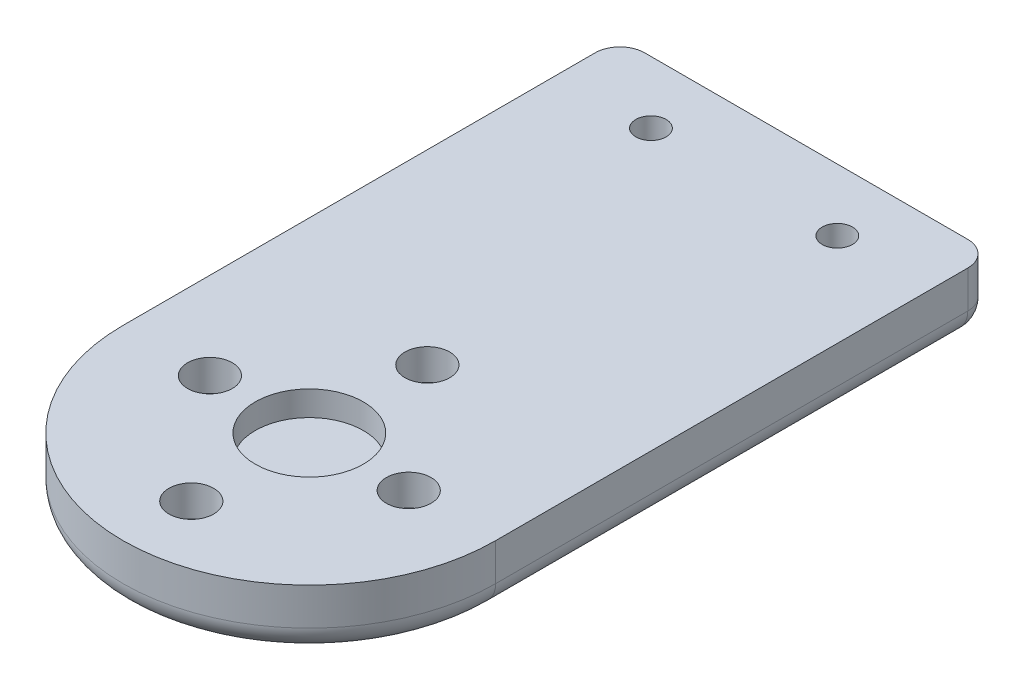
ISO-10303-21;
HEADER;
FILE_DESCRIPTION(('STEP AP214'),'2;1');
FILE_NAME('part.step','',(''),(''),'','','');
FILE_SCHEMA(('AUTOMOTIVE_DESIGN { 1 0 10303 214 1 1 1 1 }'));
ENDSEC;
DATA;
#1=APPLICATION_CONTEXT('core data for automotive mechanical design processes');
#2=APPLICATION_PROTOCOL_DEFINITION('international standard','automotive_design',2000,#1);
#3=PRODUCT_CONTEXT('',#1,'mechanical');
#4=PRODUCT('Part','Part','',(#3));
#5=PRODUCT_RELATED_PRODUCT_CATEGORY('part','',(#4));
#6=PRODUCT_DEFINITION_FORMATION('','',#4);
#7=PRODUCT_DEFINITION_CONTEXT('part definition',#1,'design');
#8=PRODUCT_DEFINITION('design','',#6,#7);
#9=PRODUCT_DEFINITION_SHAPE('','',#8);
#10=(LENGTH_UNIT() NAMED_UNIT(*) SI_UNIT(.MILLI.,.METRE.));
#11=(NAMED_UNIT(*) PLANE_ANGLE_UNIT() SI_UNIT($,.RADIAN.));
#12=(NAMED_UNIT(*) SI_UNIT($,.STERADIAN.) SOLID_ANGLE_UNIT());
#13=UNCERTAINTY_MEASURE_WITH_UNIT(LENGTH_MEASURE(1.E-05),#10,'distance_accuracy_value','');
#14=(GEOMETRIC_REPRESENTATION_CONTEXT(3) GLOBAL_UNCERTAINTY_ASSIGNED_CONTEXT((#13)) GLOBAL_UNIT_ASSIGNED_CONTEXT((#10,
#11,#12)) REPRESENTATION_CONTEXT('',''));
#15=CARTESIAN_POINT('',(0.,0.,0.));
#16=DIRECTION('',(0.,0.,1.));
#17=DIRECTION('',(1.,0.,0.));
#18=AXIS2_PLACEMENT_3D('',#15,#16,#17);
#19=CARTESIAN_POINT('',(0.,5.,0.));
#20=DIRECTION('',(0.,-1.,0.));
#21=DIRECTION('',(0.,0.,-1.));
#22=AXIS2_PLACEMENT_3D('',#19,#20,#21);
#23=CYLINDRICAL_SURFACE('',#22,15.);
#24=DIRECTION('',(0.,-1.,0.));
#25=VECTOR('',#24,1.);
#26=CARTESIAN_POINT('',(-15.,5.,0.));
#27=LINE('',#26,#25);
#28=CARTESIAN_POINT('',(-15.,5.,0.));
#29=VERTEX_POINT('',#28);
#30=CARTESIAN_POINT('',(-15.,2.,0.));
#31=VERTEX_POINT('',#30);
#32=EDGE_CURVE('E122',#29,#31,#27,.T.);
#33=ORIENTED_EDGE('',*,*,#32,.T.);
#34=CARTESIAN_POINT('',(0.,2.,0.));
#35=DIRECTION('',(0.,1.,0.));
#36=DIRECTION('',(0.,0.,1.));
#37=AXIS2_PLACEMENT_3D('',#34,#35,#36);
#38=CIRCLE('',#37,15.);
#39=CARTESIAN_POINT('',(15.,2.,0.));
#40=VERTEX_POINT('',#39);
#41=EDGE_CURVE('E121',#31,#40,#38,.T.);
#42=ORIENTED_EDGE('',*,*,#41,.T.);
#43=DIRECTION('',(0.,-1.,0.));
#44=VECTOR('',#43,1.);
#45=CARTESIAN_POINT('',(15.,5.,0.));
#46=LINE('',#45,#44);
#47=CARTESIAN_POINT('',(15.,5.,0.));
#48=VERTEX_POINT('',#47);
#49=EDGE_CURVE('E104',#48,#40,#46,.T.);
#50=ORIENTED_EDGE('',*,*,#49,.F.);
#51=CARTESIAN_POINT('',(0.,5.,0.));
#52=DIRECTION('',(0.,1.,0.));
#53=DIRECTION('',(0.,0.,1.));
#54=AXIS2_PLACEMENT_3D('',#51,#52,#53);
#55=CIRCLE('',#54,15.);
#56=EDGE_CURVE('E110',#29,#48,#55,.T.);
#57=ORIENTED_EDGE('',*,*,#56,.F.);
#58=EDGE_LOOP('',(#33,#42,#50,#57));
#59=FACE_BOUND('',#58,.T.);
#60=ADVANCED_FACE('F33',(#59),#23,.T.);
#61=CARTESIAN_POINT('',(15.,5.,-40.));
#62=DIRECTION('',(-1.,0.,0.));
#63=DIRECTION('',(0.,0.,1.));
#64=AXIS2_PLACEMENT_3D('',#61,#62,#63);
#65=PLANE('',#64);
#66=ORIENTED_EDGE('',*,*,#49,.T.);
#67=DIRECTION('',(0.,0.,-1.));
#68=VECTOR('',#67,1.);
#69=CARTESIAN_POINT('',(15.,2.,-40.));
#70=LINE('',#69,#68);
#71=CARTESIAN_POINT('',(15.,2.,-38.));
#72=VERTEX_POINT('',#71);
#73=EDGE_CURVE('E124',#40,#72,#70,.T.);
#74=ORIENTED_EDGE('',*,*,#73,.T.);
#75=DIRECTION('',(0.,-1.,0.));
#76=VECTOR('',#75,1.);
#77=CARTESIAN_POINT('',(15.,5.,-38.));
#78=LINE('',#77,#76);
#79=CARTESIAN_POINT('',(15.,5.,-38.));
#80=VERTEX_POINT('',#79);
#81=EDGE_CURVE('E107',#72,#80,#78,.F.);
#82=ORIENTED_EDGE('',*,*,#81,.T.);
#83=DIRECTION('',(0.,0.,-1.));
#84=VECTOR('',#83,1.);
#85=CARTESIAN_POINT('',(15.,5.,-40.));
#86=LINE('',#85,#84);
#87=EDGE_CURVE('E99',#48,#80,#86,.T.);
#88=ORIENTED_EDGE('',*,*,#87,.F.);
#89=EDGE_LOOP('',(#66,#74,#82,#88));
#90=FACE_BOUND('',#89,.T.);
#91=ADVANCED_FACE('F101',(#90),#65,.F.);
#92=CARTESIAN_POINT('',(-15.,5.,-40.));
#93=DIRECTION('',(0.,0.,1.));
#94=DIRECTION('',(1.,0.,0.));
#95=AXIS2_PLACEMENT_3D('',#92,#93,#94);
#96=PLANE('',#95);
#97=DIRECTION('',(-1.,0.,0.));
#98=VECTOR('',#97,1.);
#99=CARTESIAN_POINT('',(-15.,5.,-40.));
#100=LINE('',#99,#98);
#101=CARTESIAN_POINT('',(13.,5.,-40.));
#102=VERTEX_POINT('',#101);
#103=CARTESIAN_POINT('',(-13.,5.,-40.));
#104=VERTEX_POINT('',#103);
#105=EDGE_CURVE('E109',#102,#104,#100,.T.);
#106=ORIENTED_EDGE('',*,*,#105,.F.);
#107=DIRECTION('',(0.,-1.,0.));
#108=VECTOR('',#107,1.);
#109=CARTESIAN_POINT('',(13.,5.,-40.));
#110=LINE('',#109,#108);
#111=CARTESIAN_POINT('',(13.,2.,-40.));
#112=VERTEX_POINT('',#111);
#113=EDGE_CURVE('E144',#102,#112,#110,.T.);
#114=ORIENTED_EDGE('',*,*,#113,.T.);
#115=DIRECTION('',(-1.,0.,0.));
#116=VECTOR('',#115,1.);
#117=CARTESIAN_POINT('',(-15.,2.,-40.));
#118=LINE('',#117,#116);
#119=CARTESIAN_POINT('',(-13.,2.,-40.));
#120=VERTEX_POINT('',#119);
#121=EDGE_CURVE('E142',#112,#120,#118,.T.);
#122=ORIENTED_EDGE('',*,*,#121,.T.);
#123=DIRECTION('',(0.,-1.,0.));
#124=VECTOR('',#123,1.);
#125=CARTESIAN_POINT('',(-13.,5.,-40.));
#126=LINE('',#125,#124);
#127=EDGE_CURVE('E140',#120,#104,#126,.F.);
#128=ORIENTED_EDGE('',*,*,#127,.T.);
#129=EDGE_LOOP('',(#106,#114,#122,#128));
#130=FACE_BOUND('',#129,.T.);
#131=ADVANCED_FACE('F215',(#130),#96,.F.);
#132=CARTESIAN_POINT('',(-15.,5.,0.));
#133=DIRECTION('',(1.,0.,0.));
#134=DIRECTION('',(0.,0.,-1.));
#135=AXIS2_PLACEMENT_3D('',#132,#133,#134);
#136=PLANE('',#135);
#137=DIRECTION('',(0.,-1.,0.));
#138=VECTOR('',#137,1.);
#139=CARTESIAN_POINT('',(-15.,5.,-38.));
#140=LINE('',#139,#138);
#141=CARTESIAN_POINT('',(-15.,5.,-38.));
#142=VERTEX_POINT('',#141);
#143=CARTESIAN_POINT('',(-15.,2.,-38.));
#144=VERTEX_POINT('',#143);
#145=EDGE_CURVE('E50',#142,#144,#140,.T.);
#146=ORIENTED_EDGE('',*,*,#145,.T.);
#147=DIRECTION('',(0.,0.,1.));
#148=VECTOR('',#147,1.);
#149=CARTESIAN_POINT('',(-15.,2.,0.));
#150=LINE('',#149,#148);
#151=EDGE_CURVE('E147',#144,#31,#150,.T.);
#152=ORIENTED_EDGE('',*,*,#151,.T.);
#153=ORIENTED_EDGE('',*,*,#32,.F.);
#154=DIRECTION('',(0.,0.,1.));
#155=VECTOR('',#154,1.);
#156=CARTESIAN_POINT('',(-15.,5.,0.));
#157=LINE('',#156,#155);
#158=EDGE_CURVE('E114',#142,#29,#157,.T.);
#159=ORIENTED_EDGE('',*,*,#158,.F.);
#160=EDGE_LOOP('',(#146,#152,#153,#159));
#161=FACE_BOUND('',#160,.T.);
#162=ADVANCED_FACE('F213',(#161),#136,.F.);
#163=CARTESIAN_POINT('',(0.,5.,0.));
#164=DIRECTION('',(0.,1.,0.));
#165=DIRECTION('',(0.,0.,1.));
#166=AXIS2_PLACEMENT_3D('',#163,#164,#165);
#167=PLANE('',#166);
#168=CARTESIAN_POINT('',(0.,5.,-9.5));
#169=DIRECTION('',(0.,-1.,0.));
#170=DIRECTION('',(0.,0.,-1.));
#171=AXIS2_PLACEMENT_3D('',#168,#169,#170);
#172=CIRCLE('',#171,1.8);
#173=CARTESIAN_POINT('',(0.,5.,-11.3));
#174=VERTEX_POINT('',#173);
#175=EDGE_CURVE('E424',#174,#174,#172,.T.);
#176=ORIENTED_EDGE('',*,*,#175,.T.);
#177=EDGE_LOOP('',(#176));
#178=FACE_BOUND('',#177,.T.);
#179=CARTESIAN_POINT('',(-8.,5.,0.));
#180=DIRECTION('',(0.,-1.,0.));
#181=DIRECTION('',(0.,0.,-1.));
#182=AXIS2_PLACEMENT_3D('',#179,#180,#181);
#183=CIRCLE('',#182,1.8);
#184=CARTESIAN_POINT('',(-8.,5.,-1.8));
#185=VERTEX_POINT('',#184);
#186=EDGE_CURVE('E434',#185,#185,#183,.T.);
#187=ORIENTED_EDGE('',*,*,#186,.T.);
#188=EDGE_LOOP('',(#187));
#189=FACE_BOUND('',#188,.T.);
#190=CARTESIAN_POINT('',(0.,5.,9.5));
#191=DIRECTION('',(0.,-1.,0.));
#192=DIRECTION('',(0.,0.,-1.));
#193=AXIS2_PLACEMENT_3D('',#190,#191,#192);
#194=CIRCLE('',#193,1.8);
#195=CARTESIAN_POINT('',(0.,5.,7.7));
#196=VERTEX_POINT('',#195);
#197=EDGE_CURVE('E324',#196,#196,#194,.T.);
#198=ORIENTED_EDGE('',*,*,#197,.T.);
#199=EDGE_LOOP('',(#198));
#200=FACE_BOUND('',#199,.T.);
#201=CARTESIAN_POINT('',(8.,5.,0.));
#202=DIRECTION('',(0.,-1.,0.));
#203=DIRECTION('',(0.,0.,-1.));
#204=AXIS2_PLACEMENT_3D('',#201,#202,#203);
#205=CIRCLE('',#204,1.8);
#206=CARTESIAN_POINT('',(8.,5.,-1.8));
#207=VERTEX_POINT('',#206);
#208=EDGE_CURVE('E336',#207,#207,#205,.T.);
#209=ORIENTED_EDGE('',*,*,#208,.T.);
#210=EDGE_LOOP('',(#209));
#211=FACE_BOUND('',#210,.T.);
#212=CARTESIAN_POINT('',(0.,5.,0.));
#213=DIRECTION('',(0.,1.,0.));
#214=DIRECTION('',(0.,0.,1.));
#215=AXIS2_PLACEMENT_3D('',#212,#213,#214);
#216=CIRCLE('',#215,4.35);
#217=CARTESIAN_POINT('',(0.,5.,4.35));
#218=VERTEX_POINT('',#217);
#219=EDGE_CURVE('E185',#218,#218,#216,.T.);
#220=ORIENTED_EDGE('',*,*,#219,.F.);
#221=EDGE_LOOP('',(#220));
#222=FACE_BOUND('',#221,.T.);
#223=CARTESIAN_POINT('',(7.5,5.,-35.));
#224=DIRECTION('',(0.,-1.,0.));
#225=DIRECTION('',(0.,0.,-1.));
#226=AXIS2_PLACEMENT_3D('',#223,#224,#225);
#227=CIRCLE('',#226,1.2192);
#228=CARTESIAN_POINT('',(7.5,5.,-36.2192));
#229=VERTEX_POINT('',#228);
#230=EDGE_CURVE('E190',#229,#229,#227,.T.);
#231=ORIENTED_EDGE('',*,*,#230,.T.);
#232=EDGE_LOOP('',(#231));
#233=FACE_BOUND('',#232,.T.);
#234=CARTESIAN_POINT('',(-7.5,5.,-35.));
#235=DIRECTION('',(0.,-1.,0.));
#236=DIRECTION('',(0.,0.,-1.));
#237=AXIS2_PLACEMENT_3D('',#234,#235,#236);
#238=CIRCLE('',#237,1.2192);
#239=CARTESIAN_POINT('',(-7.5,5.,-36.2192));
#240=VERTEX_POINT('',#239);
#241=EDGE_CURVE('E118',#240,#240,#238,.T.);
#242=ORIENTED_EDGE('',*,*,#241,.T.);
#243=EDGE_LOOP('',(#242));
#244=FACE_BOUND('',#243,.T.);
#245=ORIENTED_EDGE('',*,*,#87,.T.);
#246=CARTESIAN_POINT('',(13.,5.,-38.));
#247=DIRECTION('',(0.,1.,0.));
#248=DIRECTION('',(0.,0.,1.));
#249=AXIS2_PLACEMENT_3D('',#246,#247,#248);
#250=CIRCLE('',#249,2.);
#251=EDGE_CURVE('E11',#80,#102,#250,.T.);
#252=ORIENTED_EDGE('',*,*,#251,.T.);
#253=ORIENTED_EDGE('',*,*,#105,.T.);
#254=CARTESIAN_POINT('',(-13.,5.,-38.));
#255=DIRECTION('',(0.,1.,0.));
#256=DIRECTION('',(0.,0.,1.));
#257=AXIS2_PLACEMENT_3D('',#254,#255,#256);
#258=CIRCLE('',#257,2.);
#259=EDGE_CURVE('E42',#104,#142,#258,.T.);
#260=ORIENTED_EDGE('',*,*,#259,.T.);
#261=ORIENTED_EDGE('',*,*,#158,.T.);
#262=ORIENTED_EDGE('',*,*,#56,.T.);
#263=EDGE_LOOP('',(#245,#252,#253,#260,#261,#262));
#264=FACE_BOUND('',#263,.T.);
#265=ADVANCED_FACE('F113',(#178,#189,#200,#211,#222,#233,#244,#264),#167,.T.);
#266=CARTESIAN_POINT('',(0.,0.,0.));
#267=DIRECTION('',(0.,1.,0.));
#268=DIRECTION('',(0.,0.,1.));
#269=AXIS2_PLACEMENT_3D('',#266,#267,#268);
#270=PLANE('',#269);
#271=CARTESIAN_POINT('',(0.,0.,-9.5));
#272=DIRECTION('',(0.,-1.,0.));
#273=DIRECTION('',(0.,0.,-1.));
#274=AXIS2_PLACEMENT_3D('',#271,#272,#273);
#275=CIRCLE('',#274,3.35);
#276=CARTESIAN_POINT('',(0.,0.,-12.85));
#277=VERTEX_POINT('',#276);
#278=EDGE_CURVE('E298',#277,#277,#275,.T.);
#279=ORIENTED_EDGE('',*,*,#278,.F.);
#280=EDGE_LOOP('',(#279));
#281=FACE_BOUND('',#280,.T.);
#282=CARTESIAN_POINT('',(-8.,0.,0.));
#283=DIRECTION('',(0.,-1.,0.));
#284=DIRECTION('',(0.,0.,-1.));
#285=AXIS2_PLACEMENT_3D('',#282,#283,#284);
#286=CIRCLE('',#285,3.35);
#287=CARTESIAN_POINT('',(-8.,0.,-3.35));
#288=VERTEX_POINT('',#287);
#289=EDGE_CURVE('E302',#288,#288,#286,.T.);
#290=ORIENTED_EDGE('',*,*,#289,.F.);
#291=EDGE_LOOP('',(#290));
#292=FACE_BOUND('',#291,.T.);
#293=CARTESIAN_POINT('',(0.,0.,9.5));
#294=DIRECTION('',(0.,-1.,0.));
#295=DIRECTION('',(0.,0.,-1.));
#296=AXIS2_PLACEMENT_3D('',#293,#294,#295);
#297=CIRCLE('',#296,3.35);
#298=CARTESIAN_POINT('',(0.,0.,6.15));
#299=VERTEX_POINT('',#298);
#300=EDGE_CURVE('E306',#299,#299,#297,.T.);
#301=ORIENTED_EDGE('',*,*,#300,.F.);
#302=EDGE_LOOP('',(#301));
#303=FACE_BOUND('',#302,.T.);
#304=CARTESIAN_POINT('',(8.,0.,0.));
#305=DIRECTION('',(0.,-1.,0.));
#306=DIRECTION('',(0.,0.,-1.));
#307=AXIS2_PLACEMENT_3D('',#304,#305,#306);
#308=CIRCLE('',#307,3.35);
#309=CARTESIAN_POINT('',(8.,0.,-3.35));
#310=VERTEX_POINT('',#309);
#311=EDGE_CURVE('E310',#310,#310,#308,.T.);
#312=ORIENTED_EDGE('',*,*,#311,.F.);
#313=EDGE_LOOP('',(#312));
#314=FACE_BOUND('',#313,.T.);
#315=DIRECTION('',(-1.,0.,0.));
#316=VECTOR('',#315,1.);
#317=CARTESIAN_POINT('',(0.,0.,-38.));
#318=LINE('',#317,#316);
#319=CARTESIAN_POINT('',(-13.,0.,-38.));
#320=VERTEX_POINT('',#319);
#321=CARTESIAN_POINT('',(13.,0.,-38.));
#322=VERTEX_POINT('',#321);
#323=EDGE_CURVE('E132',#320,#322,#318,.F.);
#324=ORIENTED_EDGE('',*,*,#323,.T.);
#325=DIRECTION('',(0.,0.,-1.));
#326=VECTOR('',#325,1.);
#327=CARTESIAN_POINT('',(13.,0.,0.));
#328=LINE('',#327,#326);
#329=CARTESIAN_POINT('',(13.,0.,0.));
#330=VERTEX_POINT('',#329);
#331=EDGE_CURVE('E136',#322,#330,#328,.F.);
#332=ORIENTED_EDGE('',*,*,#331,.T.);
#333=CARTESIAN_POINT('',(0.,0.,0.));
#334=DIRECTION('',(0.,1.,0.));
#335=DIRECTION('',(0.,0.,1.));
#336=AXIS2_PLACEMENT_3D('',#333,#334,#335);
#337=CIRCLE('',#336,13.);
#338=CARTESIAN_POINT('',(-13.,0.,0.));
#339=VERTEX_POINT('',#338);
#340=EDGE_CURVE('E134',#330,#339,#337,.F.);
#341=ORIENTED_EDGE('',*,*,#340,.T.);
#342=DIRECTION('',(0.,0.,1.));
#343=VECTOR('',#342,1.);
#344=CARTESIAN_POINT('',(-13.,0.,0.));
#345=LINE('',#344,#343);
#346=EDGE_CURVE('E130',#339,#320,#345,.F.);
#347=ORIENTED_EDGE('',*,*,#346,.T.);
#348=EDGE_LOOP('',(#324,#332,#341,#347));
#349=FACE_BOUND('',#348,.T.);
#350=CARTESIAN_POINT('',(7.5,0.,-35.));
#351=DIRECTION('',(0.,-1.,0.));
#352=DIRECTION('',(0.,0.,-1.));
#353=AXIS2_PLACEMENT_3D('',#350,#351,#352);
#354=CIRCLE('',#353,2.77875999999999);
#355=CARTESIAN_POINT('',(7.5,0.,-37.77876));
#356=VERTEX_POINT('',#355);
#357=EDGE_CURVE('E174',#356,#356,#354,.T.);
#358=ORIENTED_EDGE('',*,*,#357,.F.);
#359=EDGE_LOOP('',(#358));
#360=FACE_BOUND('',#359,.T.);
#361=CARTESIAN_POINT('',(-7.5,0.,-35.));
#362=DIRECTION('',(0.,-1.,0.));
#363=DIRECTION('',(0.,0.,-1.));
#364=AXIS2_PLACEMENT_3D('',#361,#362,#363);
#365=CIRCLE('',#364,2.77875999999999);
#366=CARTESIAN_POINT('',(-7.5,0.,-37.77876));
#367=VERTEX_POINT('',#366);
#368=EDGE_CURVE('E193',#367,#367,#365,.T.);
#369=ORIENTED_EDGE('',*,*,#368,.F.);
#370=EDGE_LOOP('',(#369));
#371=FACE_BOUND('',#370,.T.);
#372=ADVANCED_FACE('F222',(#281,#292,#303,#314,#349,#360,#371),#270,.F.);
#373=CARTESIAN_POINT('',(-7.5,0.,-35.));
#374=DIRECTION('',(0.,-1.,0.));
#375=DIRECTION('',(0.,0.,-1.));
#376=AXIS2_PLACEMENT_3D('',#373,#374,#375);
#377=CYLINDRICAL_SURFACE('',#376,1.2192);
#378=ORIENTED_EDGE('',*,*,#241,.F.);
#379=EDGE_LOOP('',(#378));
#380=FACE_BOUND('',#379,.T.);
#381=CARTESIAN_POINT('',(-7.5,2.499995,-35.));
#382=DIRECTION('',(0.,-1.,0.));
#383=DIRECTION('',(0.,0.,-1.));
#384=AXIS2_PLACEMENT_3D('',#381,#382,#383);
#385=CIRCLE('',#384,1.2192);
#386=CARTESIAN_POINT('',(-7.5,2.499995,-36.2192));
#387=VERTEX_POINT('',#386);
#388=EDGE_CURVE('E199',#387,#387,#385,.T.);
#389=ORIENTED_EDGE('',*,*,#388,.T.);
#390=EDGE_LOOP('',(#389));
#391=FACE_BOUND('',#390,.T.);
#392=ADVANCED_FACE('F286',(#380,#391),#377,.F.);
#393=CARTESIAN_POINT('',(-6.2808,2.499995,-35.));
#394=DIRECTION('',(0.,1.,0.));
#395=DIRECTION('',(0.,0.,1.));
#396=AXIS2_PLACEMENT_3D('',#393,#394,#395);
#397=PLANE('',#396);
#398=ORIENTED_EDGE('',*,*,#388,.F.);
#399=EDGE_LOOP('',(#398));
#400=FACE_BOUND('',#399,.T.);
#401=CARTESIAN_POINT('',(-7.5,2.499995,-35.));
#402=DIRECTION('',(0.,-1.,0.));
#403=DIRECTION('',(0.,0.,-1.));
#404=AXIS2_PLACEMENT_3D('',#401,#402,#403);
#405=CIRCLE('',#404,2.77876);
#406=CARTESIAN_POINT('',(-7.5,2.499995,-37.77876));
#407=VERTEX_POINT('',#406);
#408=EDGE_CURVE('E196',#407,#407,#405,.T.);
#409=ORIENTED_EDGE('',*,*,#408,.T.);
#410=EDGE_LOOP('',(#409));
#411=FACE_BOUND('',#410,.T.);
#412=ADVANCED_FACE('F282',(#400,#411),#397,.F.);
#413=CARTESIAN_POINT('',(-7.5,0.,-35.));
#414=DIRECTION('',(0.,-1.,0.));
#415=DIRECTION('',(0.,0.,-1.));
#416=AXIS2_PLACEMENT_3D('',#413,#414,#415);
#417=CYLINDRICAL_SURFACE('',#416,2.77876);
#418=ORIENTED_EDGE('',*,*,#408,.F.);
#419=EDGE_LOOP('',(#418));
#420=FACE_BOUND('',#419,.T.);
#421=ORIENTED_EDGE('',*,*,#368,.T.);
#422=EDGE_LOOP('',(#421));
#423=FACE_BOUND('',#422,.T.);
#424=ADVANCED_FACE('F278',(#420,#423),#417,.F.);
#425=CARTESIAN_POINT('',(7.5,0.,-35.));
#426=DIRECTION('',(0.,-1.,0.));
#427=DIRECTION('',(0.,0.,-1.));
#428=AXIS2_PLACEMENT_3D('',#425,#426,#427);
#429=CYLINDRICAL_SURFACE('',#428,1.2192);
#430=ORIENTED_EDGE('',*,*,#230,.F.);
#431=EDGE_LOOP('',(#430));
#432=FACE_BOUND('',#431,.T.);
#433=CARTESIAN_POINT('',(7.5,2.499995,-35.));
#434=DIRECTION('',(0.,-1.,0.));
#435=DIRECTION('',(0.,0.,-1.));
#436=AXIS2_PLACEMENT_3D('',#433,#434,#435);
#437=CIRCLE('',#436,1.2192);
#438=CARTESIAN_POINT('',(7.5,2.499995,-36.2192));
#439=VERTEX_POINT('',#438);
#440=EDGE_CURVE('E182',#439,#439,#437,.T.);
#441=ORIENTED_EDGE('',*,*,#440,.T.);
#442=EDGE_LOOP('',(#441));
#443=FACE_BOUND('',#442,.T.);
#444=ADVANCED_FACE('F269',(#432,#443),#429,.F.);
#445=CARTESIAN_POINT('',(8.7192,2.499995,-35.));
#446=DIRECTION('',(0.,1.,0.));
#447=DIRECTION('',(0.,0.,1.));
#448=AXIS2_PLACEMENT_3D('',#445,#446,#447);
#449=PLANE('',#448);
#450=ORIENTED_EDGE('',*,*,#440,.F.);
#451=EDGE_LOOP('',(#450));
#452=FACE_BOUND('',#451,.T.);
#453=CARTESIAN_POINT('',(7.5,2.499995,-35.));
#454=DIRECTION('',(0.,-1.,0.));
#455=DIRECTION('',(0.,0.,-1.));
#456=AXIS2_PLACEMENT_3D('',#453,#454,#455);
#457=CIRCLE('',#456,2.77876);
#458=CARTESIAN_POINT('',(7.5,2.499995,-37.77876));
#459=VERTEX_POINT('',#458);
#460=EDGE_CURVE('E177',#459,#459,#457,.T.);
#461=ORIENTED_EDGE('',*,*,#460,.T.);
#462=EDGE_LOOP('',(#461));
#463=FACE_BOUND('',#462,.T.);
#464=ADVANCED_FACE('F264',(#452,#463),#449,.F.);
#465=CARTESIAN_POINT('',(7.5,0.,-35.));
#466=DIRECTION('',(0.,-1.,0.));
#467=DIRECTION('',(0.,0.,-1.));
#468=AXIS2_PLACEMENT_3D('',#465,#466,#467);
#469=CYLINDRICAL_SURFACE('',#468,2.77876);
#470=ORIENTED_EDGE('',*,*,#460,.F.);
#471=EDGE_LOOP('',(#470));
#472=FACE_BOUND('',#471,.T.);
#473=ORIENTED_EDGE('',*,*,#357,.T.);
#474=EDGE_LOOP('',(#473));
#475=FACE_BOUND('',#474,.T.);
#476=ADVANCED_FACE('F261',(#472,#475),#469,.F.);
#477=CARTESIAN_POINT('',(-13.,5.,-38.));
#478=DIRECTION('',(0.,-1.,0.));
#479=DIRECTION('',(0.,0.,-1.));
#480=AXIS2_PLACEMENT_3D('',#477,#478,#479);
#481=CYLINDRICAL_SURFACE('',#480,2.);
#482=CARTESIAN_POINT('',(-13.,2.,-38.));
#483=DIRECTION('',(0.,-1.,0.));
#484=DIRECTION('',(0.,0.,-1.));
#485=AXIS2_PLACEMENT_3D('',#482,#483,#484);
#486=CIRCLE('',#485,2.);
#487=EDGE_CURVE('E37',#144,#120,#486,.T.);
#488=ORIENTED_EDGE('',*,*,#487,.F.);
#489=ORIENTED_EDGE('',*,*,#145,.F.);
#490=ORIENTED_EDGE('',*,*,#259,.F.);
#491=ORIENTED_EDGE('',*,*,#127,.F.);
#492=EDGE_LOOP('',(#488,#489,#490,#491));
#493=FACE_BOUND('',#492,.T.);
#494=ADVANCED_FACE('F35',(#493),#481,.T.);
#495=CARTESIAN_POINT('',(-13.,2.,-38.));
#496=DIRECTION('',(0.,0.,1.));
#497=DIRECTION('',(1.,0.,0.));
#498=AXIS2_PLACEMENT_3D('',#495,#496,#497);
#499=SPHERICAL_SURFACE('',#498,2.);
#500=CARTESIAN_POINT('',(-13.,2.,-38.));
#501=DIRECTION('',(-1.,0.,0.));
#502=DIRECTION('',(0.,0.,1.));
#503=AXIS2_PLACEMENT_3D('',#500,#501,#502);
#504=CIRCLE('',#503,2.);
#505=EDGE_CURVE('E164',#320,#120,#504,.F.);
#506=ORIENTED_EDGE('',*,*,#505,.F.);
#507=CARTESIAN_POINT('',(-13.,2.,-38.));
#508=DIRECTION('',(0.,0.,-1.));
#509=DIRECTION('',(-1.,0.,0.));
#510=AXIS2_PLACEMENT_3D('',#507,#508,#509);
#511=CIRCLE('',#510,2.);
#512=EDGE_CURVE('E166',#144,#320,#511,.F.);
#513=ORIENTED_EDGE('',*,*,#512,.F.);
#514=ORIENTED_EDGE('',*,*,#487,.T.);
#515=EDGE_LOOP('',(#506,#513,#514));
#516=FACE_BOUND('',#515,.T.);
#517=ADVANCED_FACE('F209',(#516),#499,.T.);
#518=CARTESIAN_POINT('',(-13.,2.,0.));
#519=DIRECTION('',(0.,0.,1.));
#520=DIRECTION('',(1.,0.,0.));
#521=AXIS2_PLACEMENT_3D('',#518,#519,#520);
#522=CYLINDRICAL_SURFACE('',#521,2.);
#523=ORIENTED_EDGE('',*,*,#512,.T.);
#524=ORIENTED_EDGE('',*,*,#346,.F.);
#525=CARTESIAN_POINT('',(-13.,2.,0.));
#526=DIRECTION('',(0.,0.,1.));
#527=DIRECTION('',(1.,0.,0.));
#528=AXIS2_PLACEMENT_3D('',#525,#526,#527);
#529=CIRCLE('',#528,2.);
#530=EDGE_CURVE('E161',#31,#339,#529,.T.);
#531=ORIENTED_EDGE('',*,*,#530,.F.);
#532=ORIENTED_EDGE('',*,*,#151,.F.);
#533=EDGE_LOOP('',(#523,#524,#531,#532));
#534=FACE_BOUND('',#533,.T.);
#535=ADVANCED_FACE('F212',(#534),#522,.T.);
#536=CARTESIAN_POINT('',(13.,5.,-38.));
#537=DIRECTION('',(0.,-1.,0.));
#538=DIRECTION('',(0.,0.,-1.));
#539=AXIS2_PLACEMENT_3D('',#536,#537,#538);
#540=CYLINDRICAL_SURFACE('',#539,2.);
#541=ORIENTED_EDGE('',*,*,#251,.F.);
#542=ORIENTED_EDGE('',*,*,#81,.F.);
#543=CARTESIAN_POINT('',(13.,2.,-38.));
#544=DIRECTION('',(0.,-1.,0.));
#545=DIRECTION('',(0.,0.,-1.));
#546=AXIS2_PLACEMENT_3D('',#543,#544,#545);
#547=CIRCLE('',#546,2.);
#548=EDGE_CURVE('E158',#112,#72,#547,.T.);
#549=ORIENTED_EDGE('',*,*,#548,.F.);
#550=ORIENTED_EDGE('',*,*,#113,.F.);
#551=EDGE_LOOP('',(#541,#542,#549,#550));
#552=FACE_BOUND('',#551,.T.);
#553=ADVANCED_FACE('F251',(#552),#540,.T.);
#554=CARTESIAN_POINT('',(-15.,2.,-38.));
#555=DIRECTION('',(-1.,0.,0.));
#556=DIRECTION('',(0.,0.,1.));
#557=AXIS2_PLACEMENT_3D('',#554,#555,#556);
#558=CYLINDRICAL_SURFACE('',#557,2.);
#559=ORIENTED_EDGE('',*,*,#505,.T.);
#560=ORIENTED_EDGE('',*,*,#121,.F.);
#561=CARTESIAN_POINT('',(13.,2.,-38.));
#562=DIRECTION('',(1.,0.,0.));
#563=DIRECTION('',(0.,0.,-1.));
#564=AXIS2_PLACEMENT_3D('',#561,#562,#563);
#565=CIRCLE('',#564,2.);
#566=EDGE_CURVE('E155',#322,#112,#565,.T.);
#567=ORIENTED_EDGE('',*,*,#566,.F.);
#568=ORIENTED_EDGE('',*,*,#323,.F.);
#569=EDGE_LOOP('',(#559,#560,#567,#568));
#570=FACE_BOUND('',#569,.T.);
#571=ADVANCED_FACE('F247',(#570),#558,.T.);
#572=CARTESIAN_POINT('',(0.,2.,0.));
#573=DIRECTION('',(0.,1.,0.));
#574=DIRECTION('',(0.,0.,1.));
#575=AXIS2_PLACEMENT_3D('',#572,#573,#574);
#576=TOROIDAL_SURFACE('',#575,13.,2.);
#577=ORIENTED_EDGE('',*,*,#530,.T.);
#578=ORIENTED_EDGE('',*,*,#340,.F.);
#579=CARTESIAN_POINT('',(13.,2.,0.));
#580=DIRECTION('',(0.,0.,-1.));
#581=DIRECTION('',(0.,1.,0.));
#582=AXIS2_PLACEMENT_3D('',#579,#580,#581);
#583=CIRCLE('',#582,2.);
#584=EDGE_CURVE('E152',#40,#330,#583,.T.);
#585=ORIENTED_EDGE('',*,*,#584,.F.);
#586=ORIENTED_EDGE('',*,*,#41,.F.);
#587=EDGE_LOOP('',(#577,#578,#585,#586));
#588=FACE_BOUND('',#587,.T.);
#589=ADVANCED_FACE('F243',(#588),#576,.T.);
#590=CARTESIAN_POINT('',(13.,2.,-38.));
#591=DIRECTION('',(0.,0.,1.));
#592=DIRECTION('',(1.,0.,0.));
#593=AXIS2_PLACEMENT_3D('',#590,#591,#592);
#594=SPHERICAL_SURFACE('',#593,2.);
#595=ORIENTED_EDGE('',*,*,#566,.T.);
#596=ORIENTED_EDGE('',*,*,#548,.T.);
#597=CARTESIAN_POINT('',(13.,2.,-38.));
#598=DIRECTION('',(0.,0.,-1.));
#599=DIRECTION('',(-1.,0.,0.));
#600=AXIS2_PLACEMENT_3D('',#597,#598,#599);
#601=CIRCLE('',#600,2.);
#602=EDGE_CURVE('E150',#322,#72,#601,.F.);
#603=ORIENTED_EDGE('',*,*,#602,.F.);
#604=EDGE_LOOP('',(#595,#596,#603));
#605=FACE_BOUND('',#604,.T.);
#606=ADVANCED_FACE('F239',(#605),#594,.T.);
#607=CARTESIAN_POINT('',(13.,2.,-40.));
#608=DIRECTION('',(0.,0.,-1.));
#609=DIRECTION('',(-1.,0.,0.));
#610=AXIS2_PLACEMENT_3D('',#607,#608,#609);
#611=CYLINDRICAL_SURFACE('',#610,2.);
#612=ORIENTED_EDGE('',*,*,#584,.T.);
#613=ORIENTED_EDGE('',*,*,#331,.F.);
#614=ORIENTED_EDGE('',*,*,#602,.T.);
#615=ORIENTED_EDGE('',*,*,#73,.F.);
#616=EDGE_LOOP('',(#612,#613,#614,#615));
#617=FACE_BOUND('',#616,.T.);
#618=ADVANCED_FACE('F235',(#617),#611,.T.);
#619=CARTESIAN_POINT('',(0.,3.,0.));
#620=DIRECTION('',(0.,1.,0.));
#621=DIRECTION('',(0.,0.,1.));
#622=AXIS2_PLACEMENT_3D('',#619,#620,#621);
#623=CYLINDRICAL_SURFACE('',#622,4.35);
#624=CARTESIAN_POINT('',(0.,3.,0.));
#625=DIRECTION('',(0.,1.,0.));
#626=DIRECTION('',(0.,0.,1.));
#627=AXIS2_PLACEMENT_3D('',#624,#625,#626);
#628=CIRCLE('',#627,4.35);
#629=CARTESIAN_POINT('',(0.,3.,4.35));
#630=VERTEX_POINT('',#629);
#631=EDGE_CURVE('E153',#630,#630,#628,.T.);
#632=ORIENTED_EDGE('',*,*,#631,.F.);
#633=EDGE_LOOP('',(#632));
#634=FACE_BOUND('',#633,.T.);
#635=ORIENTED_EDGE('',*,*,#219,.T.);
#636=EDGE_LOOP('',(#635));
#637=FACE_BOUND('',#636,.T.);
#638=ADVANCED_FACE('F238',(#634,#637),#623,.F.);
#639=CARTESIAN_POINT('',(0.,3.,0.));
#640=DIRECTION('',(0.,1.,0.));
#641=DIRECTION('',(0.,0.,1.));
#642=AXIS2_PLACEMENT_3D('',#639,#640,#641);
#643=PLANE('',#642);
#644=ORIENTED_EDGE('',*,*,#631,.T.);
#645=EDGE_LOOP('',(#644));
#646=FACE_BOUND('',#645,.T.);
#647=ADVANCED_FACE('F357',(#646),#643,.T.);
#648=CARTESIAN_POINT('',(8.,0.,0.));
#649=DIRECTION('',(0.,-1.,0.));
#650=DIRECTION('',(0.,0.,-1.));
#651=AXIS2_PLACEMENT_3D('',#648,#649,#650);
#652=CYLINDRICAL_SURFACE('',#651,1.8);
#653=ORIENTED_EDGE('',*,*,#208,.F.);
#654=EDGE_LOOP('',(#653));
#655=FACE_BOUND('',#654,.T.);
#656=CARTESIAN_POINT('',(8.,2.5,0.));
#657=DIRECTION('',(0.,-1.,0.));
#658=DIRECTION('',(0.,0.,-1.));
#659=AXIS2_PLACEMENT_3D('',#656,#657,#658);
#660=CIRCLE('',#659,1.8);
#661=CARTESIAN_POINT('',(8.,2.5,-1.8));
#662=VERTEX_POINT('',#661);
#663=EDGE_CURVE('E327',#662,#662,#660,.T.);
#664=ORIENTED_EDGE('',*,*,#663,.T.);
#665=EDGE_LOOP('',(#664));
#666=FACE_BOUND('',#665,.T.);
#667=ADVANCED_FACE('F362',(#655,#666),#652,.F.);
#668=CARTESIAN_POINT('',(9.8,2.5,0.));
#669=DIRECTION('',(0.,1.,0.));
#670=DIRECTION('',(0.,0.,1.));
#671=AXIS2_PLACEMENT_3D('',#668,#669,#670);
#672=PLANE('',#671);
#673=ORIENTED_EDGE('',*,*,#663,.F.);
#674=EDGE_LOOP('',(#673));
#675=FACE_BOUND('',#674,.T.);
#676=CARTESIAN_POINT('',(8.,2.5,0.));
#677=DIRECTION('',(0.,-1.,0.));
#678=DIRECTION('',(0.,0.,-1.));
#679=AXIS2_PLACEMENT_3D('',#676,#677,#678);
#680=CIRCLE('',#679,3.35);
#681=CARTESIAN_POINT('',(8.,2.5,-3.35));
#682=VERTEX_POINT('',#681);
#683=EDGE_CURVE('E323',#682,#682,#680,.T.);
#684=ORIENTED_EDGE('',*,*,#683,.T.);
#685=EDGE_LOOP('',(#684));
#686=FACE_BOUND('',#685,.T.);
#687=ADVANCED_FACE('F366',(#675,#686),#672,.F.);
#688=CARTESIAN_POINT('',(8.,0.,0.));
#689=DIRECTION('',(0.,-1.,0.));
#690=DIRECTION('',(0.,0.,-1.));
#691=AXIS2_PLACEMENT_3D('',#688,#689,#690);
#692=CYLINDRICAL_SURFACE('',#691,3.35);
#693=ORIENTED_EDGE('',*,*,#683,.F.);
#694=EDGE_LOOP('',(#693));
#695=FACE_BOUND('',#694,.T.);
#696=ORIENTED_EDGE('',*,*,#311,.T.);
#697=EDGE_LOOP('',(#696));
#698=FACE_BOUND('',#697,.T.);
#699=ADVANCED_FACE('F372',(#695,#698),#692,.F.);
#700=CARTESIAN_POINT('',(0.,0.,9.5));
#701=DIRECTION('',(0.,-1.,0.));
#702=DIRECTION('',(0.,0.,-1.));
#703=AXIS2_PLACEMENT_3D('',#700,#701,#702);
#704=CYLINDRICAL_SURFACE('',#703,1.8);
#705=ORIENTED_EDGE('',*,*,#197,.F.);
#706=EDGE_LOOP('',(#705));
#707=FACE_BOUND('',#706,.T.);
#708=CARTESIAN_POINT('',(0.,2.5,9.5));
#709=DIRECTION('',(0.,-1.,0.));
#710=DIRECTION('',(0.,0.,-1.));
#711=AXIS2_PLACEMENT_3D('',#708,#709,#710);
#712=CIRCLE('',#711,1.8);
#713=CARTESIAN_POINT('',(0.,2.5,7.7));
#714=VERTEX_POINT('',#713);
#715=EDGE_CURVE('E330',#714,#714,#712,.T.);
#716=ORIENTED_EDGE('',*,*,#715,.T.);
#717=EDGE_LOOP('',(#716));
#718=FACE_BOUND('',#717,.T.);
#719=ADVANCED_FACE('F376',(#707,#718),#704,.F.);
#720=CARTESIAN_POINT('',(1.8,2.5,9.5));
#721=DIRECTION('',(0.,1.,0.));
#722=DIRECTION('',(0.,0.,1.));
#723=AXIS2_PLACEMENT_3D('',#720,#721,#722);
#724=PLANE('',#723);
#725=ORIENTED_EDGE('',*,*,#715,.F.);
#726=EDGE_LOOP('',(#725));
#727=FACE_BOUND('',#726,.T.);
#728=CARTESIAN_POINT('',(0.,2.5,9.5));
#729=DIRECTION('',(0.,-1.,0.));
#730=DIRECTION('',(0.,0.,-1.));
#731=AXIS2_PLACEMENT_3D('',#728,#729,#730);
#732=CIRCLE('',#731,3.35);
#733=CARTESIAN_POINT('',(0.,2.5,6.15));
#734=VERTEX_POINT('',#733);
#735=EDGE_CURVE('E438',#734,#734,#732,.T.);
#736=ORIENTED_EDGE('',*,*,#735,.T.);
#737=EDGE_LOOP('',(#736));
#738=FACE_BOUND('',#737,.T.);
#739=ADVANCED_FACE('F380',(#727,#738),#724,.F.);
#740=CARTESIAN_POINT('',(0.,0.,9.5));
#741=DIRECTION('',(0.,-1.,0.));
#742=DIRECTION('',(0.,0.,-1.));
#743=AXIS2_PLACEMENT_3D('',#740,#741,#742);
#744=CYLINDRICAL_SURFACE('',#743,3.35);
#745=ORIENTED_EDGE('',*,*,#735,.F.);
#746=EDGE_LOOP('',(#745));
#747=FACE_BOUND('',#746,.T.);
#748=ORIENTED_EDGE('',*,*,#300,.T.);
#749=EDGE_LOOP('',(#748));
#750=FACE_BOUND('',#749,.T.);
#751=ADVANCED_FACE('F384',(#747,#750),#744,.F.);
#752=CARTESIAN_POINT('',(-8.,0.,0.));
#753=DIRECTION('',(0.,-1.,0.));
#754=DIRECTION('',(0.,0.,-1.));
#755=AXIS2_PLACEMENT_3D('',#752,#753,#754);
#756=CYLINDRICAL_SURFACE('',#755,1.8);
#757=ORIENTED_EDGE('',*,*,#186,.F.);
#758=EDGE_LOOP('',(#757));
#759=FACE_BOUND('',#758,.T.);
#760=CARTESIAN_POINT('',(-8.,2.5,0.));
#761=DIRECTION('',(0.,-1.,0.));
#762=DIRECTION('',(0.,0.,-1.));
#763=AXIS2_PLACEMENT_3D('',#760,#761,#762);
#764=CIRCLE('',#763,1.8);
#765=CARTESIAN_POINT('',(-8.,2.5,-1.8));
#766=VERTEX_POINT('',#765);
#767=EDGE_CURVE('E431',#766,#766,#764,.T.);
#768=ORIENTED_EDGE('',*,*,#767,.T.);
#769=EDGE_LOOP('',(#768));
#770=FACE_BOUND('',#769,.T.);
#771=ADVANCED_FACE('F388',(#759,#770),#756,.F.);
#772=CARTESIAN_POINT('',(-6.2,2.5,0.));
#773=DIRECTION('',(0.,1.,0.));
#774=DIRECTION('',(0.,0.,1.));
#775=AXIS2_PLACEMENT_3D('',#772,#773,#774);
#776=PLANE('',#775);
#777=ORIENTED_EDGE('',*,*,#767,.F.);
#778=EDGE_LOOP('',(#777));
#779=FACE_BOUND('',#778,.T.);
#780=CARTESIAN_POINT('',(-8.,2.5,0.));
#781=DIRECTION('',(0.,-1.,0.));
#782=DIRECTION('',(0.,0.,-1.));
#783=AXIS2_PLACEMENT_3D('',#780,#781,#782);
#784=CIRCLE('',#783,3.35);
#785=CARTESIAN_POINT('',(-8.,2.5,-3.35));
#786=VERTEX_POINT('',#785);
#787=EDGE_CURVE('E428',#786,#786,#784,.T.);
#788=ORIENTED_EDGE('',*,*,#787,.T.);
#789=EDGE_LOOP('',(#788));
#790=FACE_BOUND('',#789,.T.);
#791=ADVANCED_FACE('F392',(#779,#790),#776,.F.);
#792=CARTESIAN_POINT('',(-8.,0.,0.));
#793=DIRECTION('',(0.,-1.,0.));
#794=DIRECTION('',(0.,0.,-1.));
#795=AXIS2_PLACEMENT_3D('',#792,#793,#794);
#796=CYLINDRICAL_SURFACE('',#795,3.35);
#797=ORIENTED_EDGE('',*,*,#787,.F.);
#798=EDGE_LOOP('',(#797));
#799=FACE_BOUND('',#798,.T.);
#800=ORIENTED_EDGE('',*,*,#289,.T.);
#801=EDGE_LOOP('',(#800));
#802=FACE_BOUND('',#801,.T.);
#803=ADVANCED_FACE('F396',(#799,#802),#796,.F.);
#804=CARTESIAN_POINT('',(0.,0.,-9.5));
#805=DIRECTION('',(0.,-1.,0.));
#806=DIRECTION('',(0.,0.,-1.));
#807=AXIS2_PLACEMENT_3D('',#804,#805,#806);
#808=CYLINDRICAL_SURFACE('',#807,1.8);
#809=ORIENTED_EDGE('',*,*,#175,.F.);
#810=EDGE_LOOP('',(#809));
#811=FACE_BOUND('',#810,.T.);
#812=CARTESIAN_POINT('',(0.,2.5,-9.5));
#813=DIRECTION('',(0.,-1.,0.));
#814=DIRECTION('',(0.,0.,-1.));
#815=AXIS2_PLACEMENT_3D('',#812,#813,#814);
#816=CIRCLE('',#815,1.8);
#817=CARTESIAN_POINT('',(0.,2.5,-11.3));
#818=VERTEX_POINT('',#817);
#819=EDGE_CURVE('E419',#818,#818,#816,.T.);
#820=ORIENTED_EDGE('',*,*,#819,.T.);
#821=EDGE_LOOP('',(#820));
#822=FACE_BOUND('',#821,.T.);
#823=ADVANCED_FACE('F400',(#811,#822),#808,.F.);
#824=CARTESIAN_POINT('',(1.8,2.5,-9.5));
#825=DIRECTION('',(0.,1.,0.));
#826=DIRECTION('',(0.,0.,1.));
#827=AXIS2_PLACEMENT_3D('',#824,#825,#826);
#828=PLANE('',#827);
#829=ORIENTED_EDGE('',*,*,#819,.F.);
#830=EDGE_LOOP('',(#829));
#831=FACE_BOUND('',#830,.T.);
#832=CARTESIAN_POINT('',(0.,2.5,-9.5));
#833=DIRECTION('',(0.,-1.,0.));
#834=DIRECTION('',(0.,0.,-1.));
#835=AXIS2_PLACEMENT_3D('',#832,#833,#834);
#836=CIRCLE('',#835,3.35);
#837=CARTESIAN_POINT('',(0.,2.5,-12.85));
#838=VERTEX_POINT('',#837);
#839=EDGE_CURVE('E417',#838,#838,#836,.T.);
#840=ORIENTED_EDGE('',*,*,#839,.T.);
#841=EDGE_LOOP('',(#840));
#842=FACE_BOUND('',#841,.T.);
#843=ADVANCED_FACE('F404',(#831,#842),#828,.F.);
#844=CARTESIAN_POINT('',(0.,0.,-9.5));
#845=DIRECTION('',(0.,-1.,0.));
#846=DIRECTION('',(0.,0.,-1.));
#847=AXIS2_PLACEMENT_3D('',#844,#845,#846);
#848=CYLINDRICAL_SURFACE('',#847,3.35);
#849=ORIENTED_EDGE('',*,*,#839,.F.);
#850=EDGE_LOOP('',(#849));
#851=FACE_BOUND('',#850,.T.);
#852=ORIENTED_EDGE('',*,*,#278,.T.);
#853=EDGE_LOOP('',(#852));
#854=FACE_BOUND('',#853,.T.);
#855=ADVANCED_FACE('F408',(#851,#854),#848,.F.);
#856=CLOSED_SHELL('',(#60,#91,#131,#162,#265,#372,#392,#412,#424,#444,#464,#476,#494,#517,#535,
#553,#571,#589,#606,#618,#638,#647,#667,#687,#699,#719,#739,#751,#771,#791,#803,#823,#843,#855));
#857=MANIFOLD_SOLID_BREP('B2',#856);
#858=ADVANCED_BREP_SHAPE_REPRESENTATION('',(#18,#857),#14);
#859=SHAPE_DEFINITION_REPRESENTATION(#9,#858);
ENDSEC;
END-ISO-10303-21;
